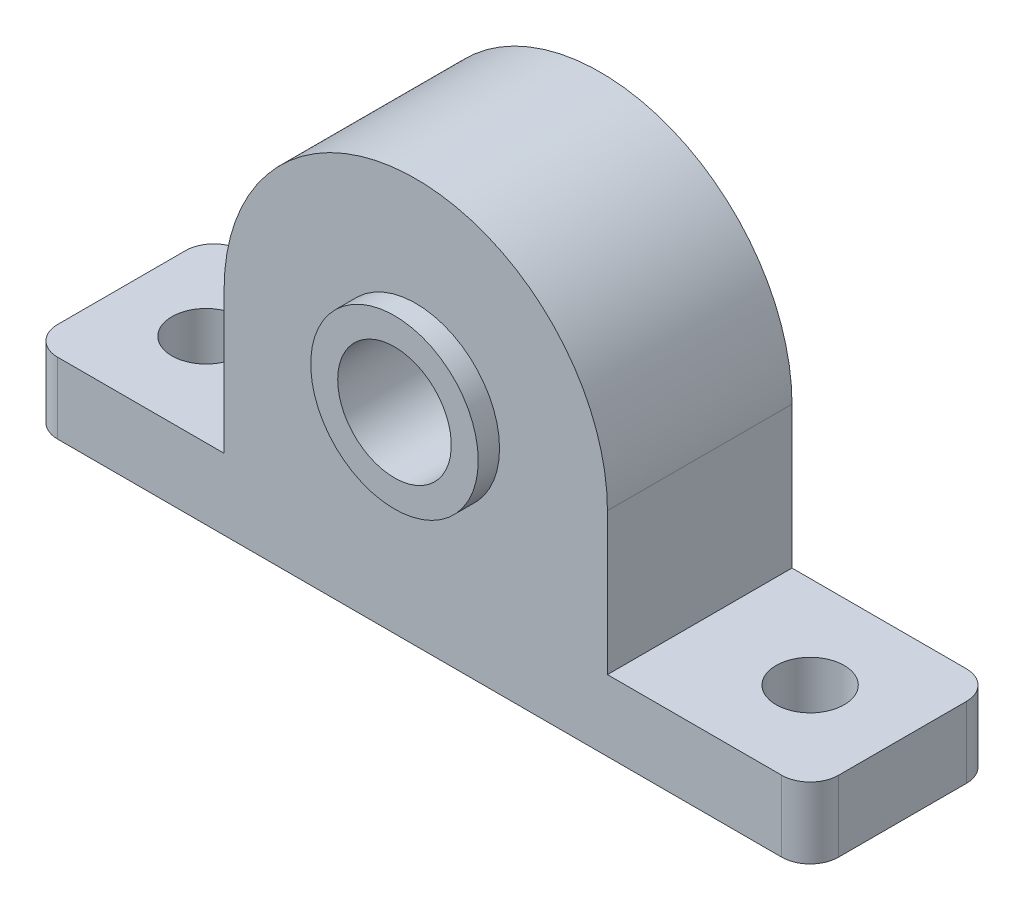
ISO-10303-21;
HEADER;
FILE_DESCRIPTION(('STEP AP214'),'2;1');
FILE_NAME('part.step','',(''),(''),'','','');
FILE_SCHEMA(('AUTOMOTIVE_DESIGN { 1 0 10303 214 1 1 1 1 }'));
ENDSEC;
DATA;
#1=APPLICATION_CONTEXT('core data for automotive mechanical design processes');
#2=APPLICATION_PROTOCOL_DEFINITION('international standard','automotive_design',2000,#1);
#3=PRODUCT_CONTEXT('',#1,'mechanical');
#4=PRODUCT('Part','Part','',(#3));
#5=PRODUCT_RELATED_PRODUCT_CATEGORY('part','',(#4));
#6=PRODUCT_DEFINITION_FORMATION('','',#4);
#7=PRODUCT_DEFINITION_CONTEXT('part definition',#1,'design');
#8=PRODUCT_DEFINITION('design','',#6,#7);
#9=PRODUCT_DEFINITION_SHAPE('','',#8);
#10=(LENGTH_UNIT() NAMED_UNIT(*) SI_UNIT(.MILLI.,.METRE.));
#11=(NAMED_UNIT(*) PLANE_ANGLE_UNIT() SI_UNIT($,.RADIAN.));
#12=(NAMED_UNIT(*) SI_UNIT($,.STERADIAN.) SOLID_ANGLE_UNIT());
#13=UNCERTAINTY_MEASURE_WITH_UNIT(LENGTH_MEASURE(1.E-05),#10,'distance_accuracy_value','');
#14=(GEOMETRIC_REPRESENTATION_CONTEXT(3) GLOBAL_UNCERTAINTY_ASSIGNED_CONTEXT((#13)) GLOBAL_UNIT_ASSIGNED_CONTEXT((#10,
#11,#12)) REPRESENTATION_CONTEXT('',''));
#15=CARTESIAN_POINT('',(0.,0.,0.));
#16=DIRECTION('',(0.,0.,1.));
#17=DIRECTION('',(1.,0.,0.));
#18=AXIS2_PLACEMENT_3D('',#15,#16,#17);
#19=CARTESIAN_POINT('',(27.2222172254654,15.,13.));
#20=DIRECTION('',(0.,0.,1.));
#21=DIRECTION('',(1.,0.,0.));
#22=AXIS2_PLACEMENT_3D('',#19,#20,#21);
#23=PLANE('',#22);
#24=DIRECTION('',(-1.,0.,0.));
#25=VECTOR('',#24,1.);
#26=CARTESIAN_POINT('',(0.,5.,13.));
#27=LINE('',#26,#25);
#28=CARTESIAN_POINT('',(13.7222172254654,5.,13.));
#29=VERTEX_POINT('',#28);
#30=CARTESIAN_POINT('',(2.,5.,13.));
#31=VERTEX_POINT('',#30);
#32=EDGE_CURVE('E162',#29,#31,#27,.T.);
#33=ORIENTED_EDGE('',*,*,#32,.T.);
#34=DIRECTION('',(0.,-1.,0.));
#35=VECTOR('',#34,1.);
#36=CARTESIAN_POINT('',(2.,0.,13.));
#37=LINE('',#36,#35);
#38=CARTESIAN_POINT('',(2.,0.,13.));
#39=VERTEX_POINT('',#38);
#40=EDGE_CURVE('E221',#31,#39,#37,.T.);
#41=ORIENTED_EDGE('',*,*,#40,.T.);
#42=DIRECTION('',(1.,0.,0.));
#43=VECTOR('',#42,1.);
#44=CARTESIAN_POINT('',(0.,0.,13.));
#45=LINE('',#44,#43);
#46=CARTESIAN_POINT('',(53.,0.,13.));
#47=VERTEX_POINT('',#46);
#48=EDGE_CURVE('E137',#39,#47,#45,.T.);
#49=ORIENTED_EDGE('',*,*,#48,.T.);
#50=DIRECTION('',(0.,1.,0.));
#51=VECTOR('',#50,1.);
#52=CARTESIAN_POINT('',(53.,5.,13.));
#53=LINE('',#52,#51);
#54=CARTESIAN_POINT('',(53.,5.,13.));
#55=VERTEX_POINT('',#54);
#56=EDGE_CURVE('E135',#47,#55,#53,.T.);
#57=ORIENTED_EDGE('',*,*,#56,.T.);
#58=DIRECTION('',(-1.,0.,0.));
#59=VECTOR('',#58,1.);
#60=CARTESIAN_POINT('',(40.7222172254654,5.,13.));
#61=LINE('',#60,#59);
#62=CARTESIAN_POINT('',(40.7222172254654,5.,13.));
#63=VERTEX_POINT('',#62);
#64=EDGE_CURVE('E127',#55,#63,#61,.T.);
#65=ORIENTED_EDGE('',*,*,#64,.T.);
#66=DIRECTION('',(0.,1.,0.));
#67=VECTOR('',#66,1.);
#68=CARTESIAN_POINT('',(40.7222172254654,15.,13.));
#69=LINE('',#68,#67);
#70=CARTESIAN_POINT('',(40.7222172254654,15.,13.));
#71=VERTEX_POINT('',#70);
#72=EDGE_CURVE('E132',#63,#71,#69,.T.);
#73=ORIENTED_EDGE('',*,*,#72,.T.);
#74=CARTESIAN_POINT('',(27.2222172254654,15.,13.));
#75=DIRECTION('',(0.,0.,1.));
#76=DIRECTION('',(1.,0.,0.));
#77=AXIS2_PLACEMENT_3D('',#74,#75,#76);
#78=CIRCLE('',#77,13.5);
#79=CARTESIAN_POINT('',(13.7222172254654,15.,13.));
#80=VERTEX_POINT('',#79);
#81=EDGE_CURVE('E153',#71,#80,#78,.T.);
#82=ORIENTED_EDGE('',*,*,#81,.T.);
#83=DIRECTION('',(0.,-1.,0.));
#84=VECTOR('',#83,1.);
#85=CARTESIAN_POINT('',(13.7222172254654,15.,13.));
#86=LINE('',#85,#84);
#87=EDGE_CURVE('E156',#80,#29,#86,.T.);
#88=ORIENTED_EDGE('',*,*,#87,.T.);
#89=EDGE_LOOP('',(#33,#41,#49,#57,#65,#73,#82,#88));
#90=FACE_BOUND('',#89,.T.);
#91=CARTESIAN_POINT('',(27.2222172254654,15.,13.));
#92=DIRECTION('',(0.,0.,1.));
#93=DIRECTION('',(1.,0.,0.));
#94=AXIS2_PLACEMENT_3D('',#91,#92,#93);
#95=CIRCLE('',#94,5.9);
#96=CARTESIAN_POINT('',(33.1222172254654,15.,13.));
#97=VERTEX_POINT('',#96);
#98=EDGE_CURVE('E296',#97,#97,#95,.T.);
#99=ORIENTED_EDGE('',*,*,#98,.F.);
#100=EDGE_LOOP('',(#99));
#101=FACE_BOUND('',#100,.T.);
#102=ADVANCED_FACE('F39',(#90,#101),#23,.T.);
#103=CARTESIAN_POINT('',(27.2222172254654,15.,0.));
#104=DIRECTION('',(0.,0.,1.));
#105=DIRECTION('',(1.,0.,0.));
#106=AXIS2_PLACEMENT_3D('',#103,#104,#105);
#107=PLANE('',#106);
#108=DIRECTION('',(1.,0.,0.));
#109=VECTOR('',#108,1.);
#110=CARTESIAN_POINT('',(0.,0.,0.));
#111=LINE('',#110,#109);
#112=CARTESIAN_POINT('',(2.,0.,0.));
#113=VERTEX_POINT('',#112);
#114=CARTESIAN_POINT('',(53.,0.,0.));
#115=VERTEX_POINT('',#114);
#116=EDGE_CURVE('E166',#113,#115,#111,.T.);
#117=ORIENTED_EDGE('',*,*,#116,.F.);
#118=DIRECTION('',(0.,-1.,0.));
#119=VECTOR('',#118,1.);
#120=CARTESIAN_POINT('',(2.,15.,0.));
#121=LINE('',#120,#119);
#122=CARTESIAN_POINT('',(2.,5.,0.));
#123=VERTEX_POINT('',#122);
#124=EDGE_CURVE('E250',#113,#123,#121,.F.);
#125=ORIENTED_EDGE('',*,*,#124,.T.);
#126=DIRECTION('',(-1.,0.,0.));
#127=VECTOR('',#126,1.);
#128=CARTESIAN_POINT('',(0.,5.,0.));
#129=LINE('',#128,#127);
#130=CARTESIAN_POINT('',(13.7222172254654,5.,0.));
#131=VERTEX_POINT('',#130);
#132=EDGE_CURVE('E182',#131,#123,#129,.T.);
#133=ORIENTED_EDGE('',*,*,#132,.F.);
#134=DIRECTION('',(0.,-1.,0.));
#135=VECTOR('',#134,1.);
#136=CARTESIAN_POINT('',(13.7222172254654,15.,0.));
#137=LINE('',#136,#135);
#138=CARTESIAN_POINT('',(13.7222172254654,15.,0.));
#139=VERTEX_POINT('',#138);
#140=EDGE_CURVE('E179',#139,#131,#137,.T.);
#141=ORIENTED_EDGE('',*,*,#140,.F.);
#142=CARTESIAN_POINT('',(27.2222172254654,15.,0.));
#143=DIRECTION('',(0.,0.,1.));
#144=DIRECTION('',(1.,0.,0.));
#145=AXIS2_PLACEMENT_3D('',#142,#143,#144);
#146=CIRCLE('',#145,13.5);
#147=CARTESIAN_POINT('',(40.7222172254654,15.,0.));
#148=VERTEX_POINT('',#147);
#149=EDGE_CURVE('E176',#148,#139,#146,.T.);
#150=ORIENTED_EDGE('',*,*,#149,.F.);
#151=DIRECTION('',(0.,1.,0.));
#152=VECTOR('',#151,1.);
#153=CARTESIAN_POINT('',(40.7222172254654,15.,0.));
#154=LINE('',#153,#152);
#155=CARTESIAN_POINT('',(40.7222172254654,5.,0.));
#156=VERTEX_POINT('',#155);
#157=EDGE_CURVE('E173',#156,#148,#154,.T.);
#158=ORIENTED_EDGE('',*,*,#157,.F.);
#159=DIRECTION('',(-1.,0.,0.));
#160=VECTOR('',#159,1.);
#161=CARTESIAN_POINT('',(40.7222172254654,5.,0.));
#162=LINE('',#161,#160);
#163=CARTESIAN_POINT('',(53.,5.,0.));
#164=VERTEX_POINT('',#163);
#165=EDGE_CURVE('E142',#164,#156,#162,.T.);
#166=ORIENTED_EDGE('',*,*,#165,.F.);
#167=DIRECTION('',(0.,1.,0.));
#168=VECTOR('',#167,1.);
#169=CARTESIAN_POINT('',(53.,15.,0.));
#170=LINE('',#169,#168);
#171=EDGE_CURVE('E247',#164,#115,#170,.F.);
#172=ORIENTED_EDGE('',*,*,#171,.T.);
#173=EDGE_LOOP('',(#117,#125,#133,#141,#150,#158,#166,#172));
#174=FACE_BOUND('',#173,.T.);
#175=CARTESIAN_POINT('',(27.2222172254654,15.,0.));
#176=DIRECTION('',(0.,0.,1.));
#177=DIRECTION('',(1.,0.,0.));
#178=AXIS2_PLACEMENT_3D('',#175,#176,#177);
#179=CIRCLE('',#178,4.);
#180=CARTESIAN_POINT('',(23.2222172254654,15.,0.));
#181=VERTEX_POINT('',#180);
#182=EDGE_CURVE('E170',#181,#181,#179,.T.);
#183=ORIENTED_EDGE('',*,*,#182,.T.);
#184=EDGE_LOOP('',(#183));
#185=FACE_BOUND('',#184,.T.);
#186=ADVANCED_FACE('F267',(#174,#185),#107,.F.);
#187=CARTESIAN_POINT('',(0.,0.,13.));
#188=DIRECTION('',(1.,0.,0.));
#189=DIRECTION('',(0.,0.,-1.));
#190=AXIS2_PLACEMENT_3D('',#187,#188,#189);
#191=PLANE('',#190);
#192=DIRECTION('',(0.,0.,-1.));
#193=VECTOR('',#192,1.);
#194=CARTESIAN_POINT('',(0.,0.,13.));
#195=LINE('',#194,#193);
#196=CARTESIAN_POINT('',(0.,0.,11.));
#197=VERTEX_POINT('',#196);
#198=CARTESIAN_POINT('',(0.,0.,2.));
#199=VERTEX_POINT('',#198);
#200=EDGE_CURVE('E205',#197,#199,#195,.T.);
#201=ORIENTED_EDGE('',*,*,#200,.F.);
#202=DIRECTION('',(0.,-1.,0.));
#203=VECTOR('',#202,1.);
#204=CARTESIAN_POINT('',(0.,5.,11.));
#205=LINE('',#204,#203);
#206=CARTESIAN_POINT('',(0.,5.,11.));
#207=VERTEX_POINT('',#206);
#208=EDGE_CURVE('E238',#197,#207,#205,.F.);
#209=ORIENTED_EDGE('',*,*,#208,.T.);
#210=DIRECTION('',(0.,0.,-1.));
#211=VECTOR('',#210,1.);
#212=CARTESIAN_POINT('',(0.,5.,13.));
#213=LINE('',#212,#211);
#214=CARTESIAN_POINT('',(0.,5.,2.));
#215=VERTEX_POINT('',#214);
#216=EDGE_CURVE('E165',#207,#215,#213,.T.);
#217=ORIENTED_EDGE('',*,*,#216,.T.);
#218=DIRECTION('',(0.,-1.,0.));
#219=VECTOR('',#218,1.);
#220=CARTESIAN_POINT('',(0.,0.,2.));
#221=LINE('',#220,#219);
#222=EDGE_CURVE('E234',#215,#199,#221,.T.);
#223=ORIENTED_EDGE('',*,*,#222,.T.);
#224=EDGE_LOOP('',(#201,#209,#217,#223));
#225=FACE_BOUND('',#224,.T.);
#226=ADVANCED_FACE('F346',(#225),#191,.F.);
#227=CARTESIAN_POINT('',(0.,0.,13.));
#228=DIRECTION('',(0.,1.,0.));
#229=DIRECTION('',(0.,0.,1.));
#230=AXIS2_PLACEMENT_3D('',#227,#228,#229);
#231=PLANE('',#230);
#232=CARTESIAN_POINT('',(48.5,0.,6.5));
#233=DIRECTION('',(0.,1.,0.));
#234=DIRECTION('',(-1.,0.,0.));
#235=AXIS2_PLACEMENT_3D('',#232,#233,#234);
#236=CIRCLE('',#235,2.4);
#237=CARTESIAN_POINT('',(46.1,0.,6.5));
#238=VERTEX_POINT('',#237);
#239=EDGE_CURVE('E307',#238,#238,#236,.T.);
#240=ORIENTED_EDGE('',*,*,#239,.T.);
#241=EDGE_LOOP('',(#240));
#242=FACE_BOUND('',#241,.T.);
#243=CARTESIAN_POINT('',(5.94443445093071,0.,6.5));
#244=DIRECTION('',(0.,1.,0.));
#245=DIRECTION('',(1.,0.,0.));
#246=AXIS2_PLACEMENT_3D('',#243,#244,#245);
#247=CIRCLE('',#246,2.4);
#248=CARTESIAN_POINT('',(8.34443445093071,0.,6.5));
#249=VERTEX_POINT('',#248);
#250=EDGE_CURVE('E312',#249,#249,#247,.T.);
#251=ORIENTED_EDGE('',*,*,#250,.T.);
#252=EDGE_LOOP('',(#251));
#253=FACE_BOUND('',#252,.T.);
#254=ORIENTED_EDGE('',*,*,#48,.F.);
#255=CARTESIAN_POINT('',(2.,0.,11.));
#256=DIRECTION('',(0.,1.,0.));
#257=DIRECTION('',(0.,0.,1.));
#258=AXIS2_PLACEMENT_3D('',#255,#256,#257);
#259=CIRCLE('',#258,2.);
#260=EDGE_CURVE('E231',#39,#197,#259,.F.);
#261=ORIENTED_EDGE('',*,*,#260,.T.);
#262=ORIENTED_EDGE('',*,*,#200,.T.);
#263=CARTESIAN_POINT('',(2.,0.,2.));
#264=DIRECTION('',(0.,1.,0.));
#265=DIRECTION('',(0.,0.,1.));
#266=AXIS2_PLACEMENT_3D('',#263,#264,#265);
#267=CIRCLE('',#266,2.);
#268=EDGE_CURVE('E228',#199,#113,#267,.F.);
#269=ORIENTED_EDGE('',*,*,#268,.T.);
#270=ORIENTED_EDGE('',*,*,#116,.T.);
#271=CARTESIAN_POINT('',(53.,0.,2.));
#272=DIRECTION('',(0.,1.,0.));
#273=DIRECTION('',(0.,0.,1.));
#274=AXIS2_PLACEMENT_3D('',#271,#272,#273);
#275=CIRCLE('',#274,2.);
#276=CARTESIAN_POINT('',(55.,0.,2.));
#277=VERTEX_POINT('',#276);
#278=EDGE_CURVE('E225',#115,#277,#275,.F.);
#279=ORIENTED_EDGE('',*,*,#278,.T.);
#280=DIRECTION('',(0.,0.,-1.));
#281=VECTOR('',#280,1.);
#282=CARTESIAN_POINT('',(55.,0.,13.));
#283=LINE('',#282,#281);
#284=CARTESIAN_POINT('',(55.,0.,11.));
#285=VERTEX_POINT('',#284);
#286=EDGE_CURVE('E201',#285,#277,#283,.T.);
#287=ORIENTED_EDGE('',*,*,#286,.F.);
#288=CARTESIAN_POINT('',(53.,0.,11.));
#289=DIRECTION('',(0.,1.,0.));
#290=DIRECTION('',(0.,0.,1.));
#291=AXIS2_PLACEMENT_3D('',#288,#289,#290);
#292=CIRCLE('',#291,2.);
#293=EDGE_CURVE('E217',#285,#47,#292,.F.);
#294=ORIENTED_EDGE('',*,*,#293,.T.);
#295=EDGE_LOOP('',(#254,#261,#262,#269,#270,#279,#287,#294));
#296=FACE_BOUND('',#295,.T.);
#297=ADVANCED_FACE('F264',(#242,#253,#296),#231,.F.);
#298=CARTESIAN_POINT('',(55.,0.,13.));
#299=DIRECTION('',(-1.,0.,0.));
#300=DIRECTION('',(0.,0.,1.));
#301=AXIS2_PLACEMENT_3D('',#298,#299,#300);
#302=PLANE('',#301);
#303=ORIENTED_EDGE('',*,*,#286,.T.);
#304=DIRECTION('',(0.,1.,0.));
#305=VECTOR('',#304,1.);
#306=CARTESIAN_POINT('',(55.,0.,2.));
#307=LINE('',#306,#305);
#308=CARTESIAN_POINT('',(55.,5.,2.));
#309=VERTEX_POINT('',#308);
#310=EDGE_CURVE('E48',#277,#309,#307,.T.);
#311=ORIENTED_EDGE('',*,*,#310,.T.);
#312=DIRECTION('',(0.,0.,-1.));
#313=VECTOR('',#312,1.);
#314=CARTESIAN_POINT('',(55.,5.,13.));
#315=LINE('',#314,#313);
#316=CARTESIAN_POINT('',(55.,5.,11.));
#317=VERTEX_POINT('',#316);
#318=EDGE_CURVE('E146',#317,#309,#315,.T.);
#319=ORIENTED_EDGE('',*,*,#318,.F.);
#320=DIRECTION('',(0.,1.,0.));
#321=VECTOR('',#320,1.);
#322=CARTESIAN_POINT('',(55.,0.,11.));
#323=LINE('',#322,#321);
#324=EDGE_CURVE('E214',#317,#285,#323,.F.);
#325=ORIENTED_EDGE('',*,*,#324,.T.);
#326=EDGE_LOOP('',(#303,#311,#319,#325));
#327=FACE_BOUND('',#326,.T.);
#328=ADVANCED_FACE('F255',(#327),#302,.F.);
#329=CARTESIAN_POINT('',(40.7222172254654,5.,13.));
#330=DIRECTION('',(0.,-1.,0.));
#331=DIRECTION('',(1.,0.,0.));
#332=AXIS2_PLACEMENT_3D('',#329,#330,#331);
#333=PLANE('',#332);
#334=CARTESIAN_POINT('',(48.5,5.,6.5));
#335=DIRECTION('',(0.,1.,0.));
#336=DIRECTION('',(-1.,0.,0.));
#337=AXIS2_PLACEMENT_3D('',#334,#335,#336);
#338=CIRCLE('',#337,2.4);
#339=CARTESIAN_POINT('',(46.1,5.,6.5));
#340=VERTEX_POINT('',#339);
#341=EDGE_CURVE('E316',#340,#340,#338,.T.);
#342=ORIENTED_EDGE('',*,*,#341,.F.);
#343=EDGE_LOOP('',(#342));
#344=FACE_BOUND('',#343,.T.);
#345=ORIENTED_EDGE('',*,*,#318,.T.);
#346=CARTESIAN_POINT('',(53.,5.,2.));
#347=DIRECTION('',(0.,-1.,0.));
#348=DIRECTION('',(1.,0.,0.));
#349=AXIS2_PLACEMENT_3D('',#346,#347,#348);
#350=CIRCLE('',#349,2.);
#351=EDGE_CURVE('E11',#309,#164,#350,.F.);
#352=ORIENTED_EDGE('',*,*,#351,.T.);
#353=ORIENTED_EDGE('',*,*,#165,.T.);
#354=DIRECTION('',(0.,0.,-1.));
#355=VECTOR('',#354,1.);
#356=CARTESIAN_POINT('',(40.7222172254654,5.,13.));
#357=LINE('',#356,#355);
#358=EDGE_CURVE('E140',#63,#156,#357,.T.);
#359=ORIENTED_EDGE('',*,*,#358,.F.);
#360=ORIENTED_EDGE('',*,*,#64,.F.);
#361=CARTESIAN_POINT('',(53.,5.,11.));
#362=DIRECTION('',(0.,-1.,0.));
#363=DIRECTION('',(1.,0.,0.));
#364=AXIS2_PLACEMENT_3D('',#361,#362,#363);
#365=CIRCLE('',#364,2.);
#366=EDGE_CURVE('E211',#55,#317,#365,.F.);
#367=ORIENTED_EDGE('',*,*,#366,.T.);
#368=EDGE_LOOP('',(#345,#352,#353,#359,#360,#367));
#369=FACE_BOUND('',#368,.T.);
#370=ADVANCED_FACE('F141',(#344,#369),#333,.F.);
#371=CARTESIAN_POINT('',(40.7222172254654,15.,13.));
#372=DIRECTION('',(-1.,0.,0.));
#373=DIRECTION('',(0.,0.,1.));
#374=AXIS2_PLACEMENT_3D('',#371,#372,#373);
#375=PLANE('',#374);
#376=ORIENTED_EDGE('',*,*,#157,.T.);
#377=DIRECTION('',(0.,0.,-1.));
#378=VECTOR('',#377,1.);
#379=CARTESIAN_POINT('',(40.7222172254654,15.,13.));
#380=LINE('',#379,#378);
#381=EDGE_CURVE('E147',#71,#148,#380,.T.);
#382=ORIENTED_EDGE('',*,*,#381,.F.);
#383=ORIENTED_EDGE('',*,*,#72,.F.);
#384=ORIENTED_EDGE('',*,*,#358,.T.);
#385=EDGE_LOOP('',(#376,#382,#383,#384));
#386=FACE_BOUND('',#385,.T.);
#387=ADVANCED_FACE('F149',(#386),#375,.F.);
#388=CARTESIAN_POINT('',(27.2222172254654,15.,13.));
#389=DIRECTION('',(0.,0.,-1.));
#390=DIRECTION('',(-1.,0.,0.));
#391=AXIS2_PLACEMENT_3D('',#388,#389,#390);
#392=CYLINDRICAL_SURFACE('',#391,13.5);
#393=ORIENTED_EDGE('',*,*,#149,.T.);
#394=DIRECTION('',(0.,0.,-1.));
#395=VECTOR('',#394,1.);
#396=CARTESIAN_POINT('',(13.7222172254654,15.,13.));
#397=LINE('',#396,#395);
#398=EDGE_CURVE('E193',#80,#139,#397,.T.);
#399=ORIENTED_EDGE('',*,*,#398,.F.);
#400=ORIENTED_EDGE('',*,*,#81,.F.);
#401=ORIENTED_EDGE('',*,*,#381,.T.);
#402=EDGE_LOOP('',(#393,#399,#400,#401));
#403=FACE_BOUND('',#402,.T.);
#404=ADVANCED_FACE('F273',(#403),#392,.T.);
#405=CARTESIAN_POINT('',(13.7222172254654,15.,13.));
#406=DIRECTION('',(1.,0.,0.));
#407=DIRECTION('',(0.,0.,-1.));
#408=AXIS2_PLACEMENT_3D('',#405,#406,#407);
#409=PLANE('',#408);
#410=ORIENTED_EDGE('',*,*,#140,.T.);
#411=DIRECTION('',(0.,0.,-1.));
#412=VECTOR('',#411,1.);
#413=CARTESIAN_POINT('',(13.7222172254654,5.,13.));
#414=LINE('',#413,#412);
#415=EDGE_CURVE('E189',#29,#131,#414,.T.);
#416=ORIENTED_EDGE('',*,*,#415,.F.);
#417=ORIENTED_EDGE('',*,*,#87,.F.);
#418=ORIENTED_EDGE('',*,*,#398,.T.);
#419=EDGE_LOOP('',(#410,#416,#417,#418));
#420=FACE_BOUND('',#419,.T.);
#421=ADVANCED_FACE('F280',(#420),#409,.F.);
#422=CARTESIAN_POINT('',(0.,5.,13.));
#423=DIRECTION('',(0.,-1.,0.));
#424=DIRECTION('',(0.,0.,-1.));
#425=AXIS2_PLACEMENT_3D('',#422,#423,#424);
#426=PLANE('',#425);
#427=CARTESIAN_POINT('',(5.94443445093071,5.,6.5));
#428=DIRECTION('',(0.,1.,0.));
#429=DIRECTION('',(1.,0.,0.));
#430=AXIS2_PLACEMENT_3D('',#427,#428,#429);
#431=CIRCLE('',#430,2.4);
#432=CARTESIAN_POINT('',(8.34443445093071,5.,6.5));
#433=VERTEX_POINT('',#432);
#434=EDGE_CURVE('E308',#433,#433,#431,.T.);
#435=ORIENTED_EDGE('',*,*,#434,.F.);
#436=EDGE_LOOP('',(#435));
#437=FACE_BOUND('',#436,.T.);
#438=ORIENTED_EDGE('',*,*,#216,.F.);
#439=CARTESIAN_POINT('',(2.,5.,11.));
#440=DIRECTION('',(0.,-1.,0.));
#441=DIRECTION('',(0.,0.,-1.));
#442=AXIS2_PLACEMENT_3D('',#439,#440,#441);
#443=CIRCLE('',#442,2.);
#444=EDGE_CURVE('E244',#207,#31,#443,.F.);
#445=ORIENTED_EDGE('',*,*,#444,.T.);
#446=ORIENTED_EDGE('',*,*,#32,.F.);
#447=ORIENTED_EDGE('',*,*,#415,.T.);
#448=ORIENTED_EDGE('',*,*,#132,.T.);
#449=CARTESIAN_POINT('',(2.,5.,2.));
#450=DIRECTION('',(0.,-1.,0.));
#451=DIRECTION('',(0.,0.,-1.));
#452=AXIS2_PLACEMENT_3D('',#449,#450,#451);
#453=CIRCLE('',#452,2.);
#454=EDGE_CURVE('E241',#123,#215,#453,.F.);
#455=ORIENTED_EDGE('',*,*,#454,.T.);
#456=EDGE_LOOP('',(#438,#445,#446,#447,#448,#455));
#457=FACE_BOUND('',#456,.T.);
#458=ADVANCED_FACE('F284',(#437,#457),#426,.F.);
#459=CARTESIAN_POINT('',(27.2222172254654,15.,13.));
#460=DIRECTION('',(0.,0.,-1.));
#461=DIRECTION('',(-1.,0.,0.));
#462=AXIS2_PLACEMENT_3D('',#459,#460,#461);
#463=CYLINDRICAL_SURFACE('',#462,4.);
#464=CARTESIAN_POINT('',(27.2222172254654,15.,14.5));
#465=DIRECTION('',(0.,0.,1.));
#466=DIRECTION('',(1.,0.,0.));
#467=AXIS2_PLACEMENT_3D('',#464,#465,#466);
#468=CIRCLE('',#467,4.);
#469=CARTESIAN_POINT('',(23.2222172254654,15.,14.5));
#470=VERTEX_POINT('',#469);
#471=EDGE_CURVE('E300',#470,#470,#468,.T.);
#472=CARTESIAN_POINT('',(23.2222172254654,15.,0.));
#473=CARTESIAN_POINT('',(23.2222172254654,15.,0.151041666666667));
#474=CARTESIAN_POINT('',(23.2222172254654,15.,0.302083333333334));
#475=CARTESIAN_POINT('',(23.2222172254654,15.,0.604166666666667));
#476=CARTESIAN_POINT('',(23.2222172254654,15.,0.755208333333334));
#477=CARTESIAN_POINT('',(23.2222172254654,15.,1.05729166666667));
#478=CARTESIAN_POINT('',(23.2222172254654,15.,1.20833333333333));
#479=CARTESIAN_POINT('',(23.2222172254654,15.,1.51041666666667));
#480=CARTESIAN_POINT('',(23.2222172254654,15.,1.66145833333333));
#481=CARTESIAN_POINT('',(23.2222172254654,15.,1.96354166666667));
#482=CARTESIAN_POINT('',(23.2222172254654,15.,2.11458333333333));
#483=CARTESIAN_POINT('',(23.2222172254654,15.,2.41666666666667));
#484=CARTESIAN_POINT('',(23.2222172254654,15.,2.56770833333333));
#485=CARTESIAN_POINT('',(23.2222172254654,15.,2.86979166666667));
#486=CARTESIAN_POINT('',(23.2222172254654,15.,3.02083333333333));
#487=CARTESIAN_POINT('',(23.2222172254654,15.,3.32291666666667));
#488=CARTESIAN_POINT('',(23.2222172254654,15.,3.47395833333333));
#489=CARTESIAN_POINT('',(23.2222172254654,15.,3.77604166666667));
#490=CARTESIAN_POINT('',(23.2222172254654,15.,3.92708333333333));
#491=CARTESIAN_POINT('',(23.2222172254654,15.,4.22916666666667));
#492=CARTESIAN_POINT('',(23.2222172254654,15.,4.38020833333333));
#493=CARTESIAN_POINT('',(23.2222172254654,15.,4.68229166666667));
#494=CARTESIAN_POINT('',(23.2222172254654,15.,4.83333333333333));
#495=CARTESIAN_POINT('',(23.2222172254654,15.,5.13541666666667));
#496=CARTESIAN_POINT('',(23.2222172254654,15.,5.28645833333333));
#497=CARTESIAN_POINT('',(23.2222172254654,15.,5.58854166666667));
#498=CARTESIAN_POINT('',(23.2222172254654,15.,5.73958333333333));
#499=CARTESIAN_POINT('',(23.2222172254654,15.,6.04166666666667));
#500=CARTESIAN_POINT('',(23.2222172254654,15.,6.19270833333333));
#501=CARTESIAN_POINT('',(23.2222172254654,15.,6.49479166666667));
#502=CARTESIAN_POINT('',(23.2222172254654,15.,6.64583333333333));
#503=CARTESIAN_POINT('',(23.2222172254654,15.,6.94791666666666));
#504=CARTESIAN_POINT('',(23.2222172254654,15.,7.09895833333333));
#505=CARTESIAN_POINT('',(23.2222172254654,15.,7.40104166666667));
#506=CARTESIAN_POINT('',(23.2222172254654,15.,7.55208333333333));
#507=CARTESIAN_POINT('',(23.2222172254654,15.,7.85416666666667));
#508=CARTESIAN_POINT('',(23.2222172254654,15.,8.00520833333333));
#509=CARTESIAN_POINT('',(23.2222172254654,15.,8.30729166666667));
#510=CARTESIAN_POINT('',(23.2222172254654,15.,8.45833333333333));
#511=CARTESIAN_POINT('',(23.2222172254654,15.,8.76041666666666));
#512=CARTESIAN_POINT('',(23.2222172254654,15.,8.91145833333333));
#513=CARTESIAN_POINT('',(23.2222172254654,15.,9.21354166666666));
#514=CARTESIAN_POINT('',(23.2222172254654,15.,9.36458333333333));
#515=CARTESIAN_POINT('',(23.2222172254654,15.,9.66666666666666));
#516=CARTESIAN_POINT('',(23.2222172254654,15.,9.81770833333333));
#517=CARTESIAN_POINT('',(23.2222172254654,15.,10.1197916666667));
#518=CARTESIAN_POINT('',(23.2222172254654,15.,10.2708333333333));
#519=CARTESIAN_POINT('',(23.2222172254654,15.,10.5729166666667));
#520=CARTESIAN_POINT('',(23.2222172254654,15.,10.7239583333333));
#521=CARTESIAN_POINT('',(23.2222172254654,15.,11.0260416666667));
#522=CARTESIAN_POINT('',(23.2222172254654,15.,11.1770833333333));
#523=CARTESIAN_POINT('',(23.2222172254654,15.,11.4791666666667));
#524=CARTESIAN_POINT('',(23.2222172254654,15.,11.6302083333333));
#525=CARTESIAN_POINT('',(23.2222172254654,15.,11.9322916666667));
#526=CARTESIAN_POINT('',(23.2222172254654,15.,12.0833333333333));
#527=CARTESIAN_POINT('',(23.2222172254654,15.,12.3854166666667));
#528=CARTESIAN_POINT('',(23.2222172254654,15.,12.5364583333333));
#529=CARTESIAN_POINT('',(23.2222172254654,15.,12.8385416666667));
#530=CARTESIAN_POINT('',(23.2222172254654,15.,12.9895833333333));
#531=CARTESIAN_POINT('',(23.2222172254654,15.,13.2916666666667));
#532=CARTESIAN_POINT('',(23.2222172254654,15.,13.4427083333333));
#533=CARTESIAN_POINT('',(23.2222172254654,15.,13.7447916666667));
#534=CARTESIAN_POINT('',(23.2222172254654,15.,13.8958333333333));
#535=CARTESIAN_POINT('',(23.2222172254654,15.,14.1979166666667));
#536=CARTESIAN_POINT('',(23.2222172254654,15.,14.3489583333333));
#537=CARTESIAN_POINT('',(23.2222172254654,15.,14.5));
#538=B_SPLINE_CURVE_WITH_KNOTS('',3,(#472,#473,#474,#475,#476,#477,#478,#479,#480,#481,#482,
#483,#484,#485,#486,#487,#488,#489,#490,#491,#492,#493,#494,#495,#496,#497,#498,#499,#500,#501,
#502,#503,#504,#505,#506,#507,#508,#509,#510,#511,#512,#513,#514,#515,#516,#517,#518,#519,#520,
#521,#522,#523,#524,#525,#526,#527,#528,#529,#530,#531,#532,#533,#534,#535,#536,#537),
.UNSPECIFIED.,.F.,.F.,(4,2,2,2,2,2,2,2,2,2,2,2,2,2,2,2,2,2,2,2,2,2,2,2,2,2,2,2,2,2,2,2,4),(0.,
0.453125,0.906250000000001,1.359375,1.8125,2.265625,2.71875,3.171875,3.625,4.078125,4.53125,
4.984375,5.4375,5.890625,6.34375,6.796875,7.25,7.703125,8.15625,8.609375,9.0625,9.515625,
9.96875,10.421875,10.875,11.328125,11.78125,12.234375,12.6875,13.140625,13.59375,14.046875,
14.5),.UNSPECIFIED.);
#539=EDGE_CURVE('BSEAM349',#181,#470,#538,.T.);
#540=ORIENTED_EDGE('',*,*,#182,.F.);
#541=ORIENTED_EDGE('',*,*,#471,.T.);
#542=ORIENTED_EDGE('',*,*,#539,.T.);
#543=ORIENTED_EDGE('',*,*,#539,.F.);
#544=EDGE_LOOP('',(#540,#542,#541,#543));
#545=FACE_BOUND('',#544,.T.);
#546=ADVANCED_FACE('F349',(#545),#463,.F.);
#547=CARTESIAN_POINT('',(27.2222172254654,15.,14.5));
#548=DIRECTION('',(0.,0.,1.));
#549=DIRECTION('',(1.,0.,0.));
#550=AXIS2_PLACEMENT_3D('',#547,#548,#549);
#551=PLANE('',#550);
#552=CARTESIAN_POINT('',(27.2222172254654,15.,14.5));
#553=DIRECTION('',(0.,0.,1.));
#554=DIRECTION('',(1.,0.,0.));
#555=AXIS2_PLACEMENT_3D('',#552,#553,#554);
#556=CIRCLE('',#555,5.9);
#557=CARTESIAN_POINT('',(33.1222172254654,15.,14.5));
#558=VERTEX_POINT('',#557);
#559=EDGE_CURVE('E295',#558,#558,#556,.T.);
#560=ORIENTED_EDGE('',*,*,#559,.T.);
#561=EDGE_LOOP('',(#560));
#562=FACE_BOUND('',#561,.T.);
#563=ORIENTED_EDGE('',*,*,#471,.F.);
#564=EDGE_LOOP('',(#563));
#565=FACE_BOUND('',#564,.T.);
#566=ADVANCED_FACE('F377',(#562,#565),#551,.T.);
#567=CARTESIAN_POINT('',(27.2222172254654,15.,14.5));
#568=DIRECTION('',(0.,0.,-1.));
#569=DIRECTION('',(-1.,0.,0.));
#570=AXIS2_PLACEMENT_3D('',#567,#568,#569);
#571=CYLINDRICAL_SURFACE('',#570,5.9);
#572=ORIENTED_EDGE('',*,*,#559,.F.);
#573=EDGE_LOOP('',(#572));
#574=FACE_BOUND('',#573,.T.);
#575=ORIENTED_EDGE('',*,*,#98,.T.);
#576=EDGE_LOOP('',(#575));
#577=FACE_BOUND('',#576,.T.);
#578=ADVANCED_FACE('F384',(#574,#577),#571,.T.);
#579=CARTESIAN_POINT('',(5.94443445093071,0.,6.5));
#580=DIRECTION('',(0.,1.,0.));
#581=DIRECTION('',(-1.,0.,0.));
#582=AXIS2_PLACEMENT_3D('',#579,#580,#581);
#583=CYLINDRICAL_SURFACE('',#582,2.4);
#584=ORIENTED_EDGE('',*,*,#250,.F.);
#585=EDGE_LOOP('',(#584));
#586=FACE_BOUND('',#585,.T.);
#587=ORIENTED_EDGE('',*,*,#434,.T.);
#588=EDGE_LOOP('',(#587));
#589=FACE_BOUND('',#588,.T.);
#590=ADVANCED_FACE('F329',(#586,#589),#583,.F.);
#591=CARTESIAN_POINT('',(48.5,0.,6.5));
#592=DIRECTION('',(0.,1.,0.));
#593=DIRECTION('',(-1.,0.,0.));
#594=AXIS2_PLACEMENT_3D('',#591,#592,#593);
#595=CYLINDRICAL_SURFACE('',#594,2.4);
#596=ORIENTED_EDGE('',*,*,#239,.F.);
#597=EDGE_LOOP('',(#596));
#598=FACE_BOUND('',#597,.T.);
#599=ORIENTED_EDGE('',*,*,#341,.T.);
#600=EDGE_LOOP('',(#599));
#601=FACE_BOUND('',#600,.T.);
#602=ADVANCED_FACE('F326',(#598,#601),#595,.F.);
#603=CARTESIAN_POINT('',(53.,15.,11.));
#604=DIRECTION('',(0.,-1.,0.));
#605=DIRECTION('',(0.,0.,-1.));
#606=AXIS2_PLACEMENT_3D('',#603,#604,#605);
#607=CYLINDRICAL_SURFACE('',#606,2.);
#608=ORIENTED_EDGE('',*,*,#293,.F.);
#609=ORIENTED_EDGE('',*,*,#324,.F.);
#610=ORIENTED_EDGE('',*,*,#366,.F.);
#611=ORIENTED_EDGE('',*,*,#56,.F.);
#612=EDGE_LOOP('',(#608,#609,#610,#611));
#613=FACE_BOUND('',#612,.T.);
#614=ADVANCED_FACE('F261',(#613),#607,.T.);
#615=CARTESIAN_POINT('',(2.,15.,11.));
#616=DIRECTION('',(0.,1.,0.));
#617=DIRECTION('',(0.,0.,1.));
#618=AXIS2_PLACEMENT_3D('',#615,#616,#617);
#619=CYLINDRICAL_SURFACE('',#618,2.);
#620=ORIENTED_EDGE('',*,*,#444,.F.);
#621=ORIENTED_EDGE('',*,*,#208,.F.);
#622=ORIENTED_EDGE('',*,*,#260,.F.);
#623=ORIENTED_EDGE('',*,*,#40,.F.);
#624=EDGE_LOOP('',(#620,#621,#622,#623));
#625=FACE_BOUND('',#624,.T.);
#626=ADVANCED_FACE('F288',(#625),#619,.T.);
#627=CARTESIAN_POINT('',(2.,0.,2.));
#628=DIRECTION('',(0.,-1.,0.));
#629=DIRECTION('',(0.,0.,-1.));
#630=AXIS2_PLACEMENT_3D('',#627,#628,#629);
#631=CYLINDRICAL_SURFACE('',#630,2.);
#632=ORIENTED_EDGE('',*,*,#454,.F.);
#633=ORIENTED_EDGE('',*,*,#124,.F.);
#634=ORIENTED_EDGE('',*,*,#268,.F.);
#635=ORIENTED_EDGE('',*,*,#222,.F.);
#636=EDGE_LOOP('',(#632,#633,#634,#635));
#637=FACE_BOUND('',#636,.T.);
#638=ADVANCED_FACE('F414',(#637),#631,.T.);
#639=CARTESIAN_POINT('',(53.,0.,2.));
#640=DIRECTION('',(0.,1.,0.));
#641=DIRECTION('',(0.,0.,1.));
#642=AXIS2_PLACEMENT_3D('',#639,#640,#641);
#643=CYLINDRICAL_SURFACE('',#642,2.);
#644=ORIENTED_EDGE('',*,*,#278,.F.);
#645=ORIENTED_EDGE('',*,*,#171,.F.);
#646=ORIENTED_EDGE('',*,*,#351,.F.);
#647=ORIENTED_EDGE('',*,*,#310,.F.);
#648=EDGE_LOOP('',(#644,#645,#646,#647));
#649=FACE_BOUND('',#648,.T.);
#650=ADVANCED_FACE('F41',(#649),#643,.T.);
#651=CLOSED_SHELL('',(#102,#186,#226,#297,#328,#370,#387,#404,#421,#458,#546,#566,#578,#590,
#602,#614,#626,#638,#650));
#652=MANIFOLD_SOLID_BREP('B2',#651);
#653=ADVANCED_BREP_SHAPE_REPRESENTATION('',(#18,#652),#14);
#654=SHAPE_DEFINITION_REPRESENTATION(#9,#653);
ENDSEC;
END-ISO-10303-21;
